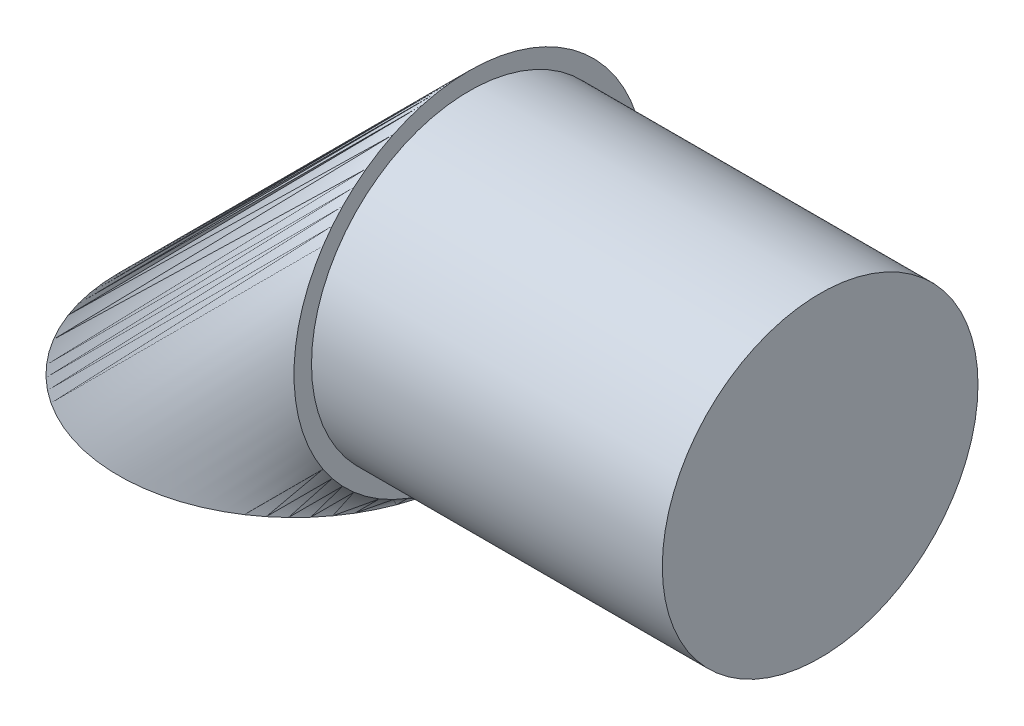
ISO-10303-21;
HEADER;
FILE_DESCRIPTION(('STEP AP214'),'2;1');
FILE_NAME('part.step','',(''),(''),'','','');
FILE_SCHEMA(('AUTOMOTIVE_DESIGN { 1 0 10303 214 1 1 1 1 }'));
ENDSEC;
DATA;
#1=APPLICATION_CONTEXT('core data for automotive mechanical design processes');
#2=APPLICATION_PROTOCOL_DEFINITION('international standard','automotive_design',2000,#1);
#3=PRODUCT_CONTEXT('',#1,'mechanical');
#4=PRODUCT('Part','Part','',(#3));
#5=PRODUCT_RELATED_PRODUCT_CATEGORY('part','',(#4));
#6=PRODUCT_DEFINITION_FORMATION('','',#4);
#7=PRODUCT_DEFINITION_CONTEXT('part definition',#1,'design');
#8=PRODUCT_DEFINITION('design','',#6,#7);
#9=PRODUCT_DEFINITION_SHAPE('','',#8);
#10=(LENGTH_UNIT() NAMED_UNIT(*) SI_UNIT(.MILLI.,.METRE.));
#11=(NAMED_UNIT(*) PLANE_ANGLE_UNIT() SI_UNIT($,.RADIAN.));
#12=(NAMED_UNIT(*) SI_UNIT($,.STERADIAN.) SOLID_ANGLE_UNIT());
#13=UNCERTAINTY_MEASURE_WITH_UNIT(LENGTH_MEASURE(1.E-05),#10,'distance_accuracy_value','');
#14=(GEOMETRIC_REPRESENTATION_CONTEXT(3) GLOBAL_UNCERTAINTY_ASSIGNED_CONTEXT((#13)) GLOBAL_UNIT_ASSIGNED_CONTEXT((#10,
#11,#12)) REPRESENTATION_CONTEXT('',''));
#15=CARTESIAN_POINT('',(0.,0.,0.));
#16=DIRECTION('',(0.,0.,1.));
#17=DIRECTION('',(1.,0.,0.));
#18=AXIS2_PLACEMENT_3D('',#15,#16,#17);
#19=CARTESIAN_POINT('',(0.,0.,0.));
#20=DIRECTION('',(0.,1.,0.));
#21=DIRECTION('',(0.,0.,1.));
#22=AXIS2_PLACEMENT_3D('',#19,#20,#21);
#23=PLANE('',#22);
#24=CARTESIAN_POINT('',(0.,0.,0.));
#25=DIRECTION('',(0.,1.,0.));
#26=DIRECTION('',(0.,0.,1.));
#27=AXIS2_PLACEMENT_3D('',#24,#25,#26);
#28=CIRCLE('',#27,50.);
#29=CARTESIAN_POINT('',(50.,0.,0.));
#30=VERTEX_POINT('',#29);
#31=EDGE_CURVE('E59',#30,#30,#28,.T.);
#32=ORIENTED_EDGE('',*,*,#31,.F.);
#33=EDGE_LOOP('',(#32));
#34=FACE_BOUND('',#33,.T.);
#35=ADVANCED_FACE('F47',(#34),#23,.F.);
#36=CARTESIAN_POINT('',(50.,50.,0.));
#37=DIRECTION('',(1.,0.,0.));
#38=DIRECTION('',(0.,0.,1.));
#39=AXIS2_PLACEMENT_3D('',#36,#37,#38);
#40=PLANE('',#39);
#41=CARTESIAN_POINT('',(50.,50.,0.));
#42=DIRECTION('',(1.,0.,0.));
#43=DIRECTION('',(0.,0.,-1.));
#44=AXIS2_PLACEMENT_3D('',#41,#42,#43);
#45=CIRCLE('',#44,45.);
#46=CARTESIAN_POINT('',(50.,50.,-45.));
#47=VERTEX_POINT('',#46);
#48=EDGE_CURVE('E11',#47,#47,#45,.T.);
#49=ORIENTED_EDGE('',*,*,#48,.F.);
#50=EDGE_LOOP('',(#49));
#51=FACE_BOUND('',#50,.T.);
#52=CARTESIAN_POINT('',(50.,50.,0.));
#53=DIRECTION('',(1.,0.,0.));
#54=DIRECTION('',(0.,0.,1.));
#55=AXIS2_PLACEMENT_3D('',#52,#53,#54);
#56=CIRCLE('',#55,50.);
#57=EDGE_CURVE('E50',#30,#30,#56,.T.);
#58=ORIENTED_EDGE('',*,*,#57,.T.);
#59=EDGE_LOOP('',(#58));
#60=FACE_BOUND('',#59,.T.);
#61=ADVANCED_FACE('F66',(#51,#60),#40,.T.);
#62=CARTESIAN_POINT('',(50.,0.,0.));
#63=DIRECTION('',(0.,0.,-1.));
#64=DIRECTION('',(-1.,0.,0.));
#65=AXIS2_PLACEMENT_3D('',#62,#63,#64);
#66=DEGENERATE_TOROIDAL_SURFACE('',#65,50.,50.,.T.);
#67=ORIENTED_EDGE('',*,*,#57,.F.);
#68=ORIENTED_EDGE('',*,*,#31,.T.);
#69=EDGE_LOOP('',(#67,#68));
#70=FACE_BOUND('',#69,.T.);
#71=ADVANCED_FACE('F78',(#70),#66,.T.);
#72=CARTESIAN_POINT('',(150.,50.,0.));
#73=DIRECTION('',(-1.,0.,0.));
#74=DIRECTION('',(0.,0.,1.));
#75=AXIS2_PLACEMENT_3D('',#72,#73,#74);
#76=CYLINDRICAL_SURFACE('',#75,45.);
#77=CARTESIAN_POINT('',(150.,50.,0.));
#78=DIRECTION('',(1.,0.,0.));
#79=DIRECTION('',(0.,0.,-1.));
#80=AXIS2_PLACEMENT_3D('',#77,#78,#79);
#81=CIRCLE('',#80,45.);
#82=CARTESIAN_POINT('',(150.,50.,-45.));
#83=VERTEX_POINT('',#82);
#84=EDGE_CURVE('E64',#83,#83,#81,.T.);
#85=ORIENTED_EDGE('',*,*,#84,.F.);
#86=EDGE_LOOP('',(#85));
#87=FACE_BOUND('',#86,.T.);
#88=ORIENTED_EDGE('',*,*,#48,.T.);
#89=EDGE_LOOP('',(#88));
#90=FACE_BOUND('',#89,.T.);
#91=ADVANCED_FACE('F75',(#87,#90),#76,.T.);
#92=CARTESIAN_POINT('',(150.,50.,0.));
#93=DIRECTION('',(1.,0.,0.));
#94=DIRECTION('',(0.,0.,-1.));
#95=AXIS2_PLACEMENT_3D('',#92,#93,#94);
#96=PLANE('',#95);
#97=ORIENTED_EDGE('',*,*,#84,.T.);
#98=EDGE_LOOP('',(#97));
#99=FACE_BOUND('',#98,.T.);
#100=ADVANCED_FACE('F73',(#99),#96,.T.);
#101=CLOSED_SHELL('',(#35,#61,#71,#91,#100));
#102=MANIFOLD_SOLID_BREP('B2',#101);
#103=ADVANCED_BREP_SHAPE_REPRESENTATION('',(#18,#102),#14);
#104=SHAPE_DEFINITION_REPRESENTATION(#9,#103);
ENDSEC;
END-ISO-10303-21;
